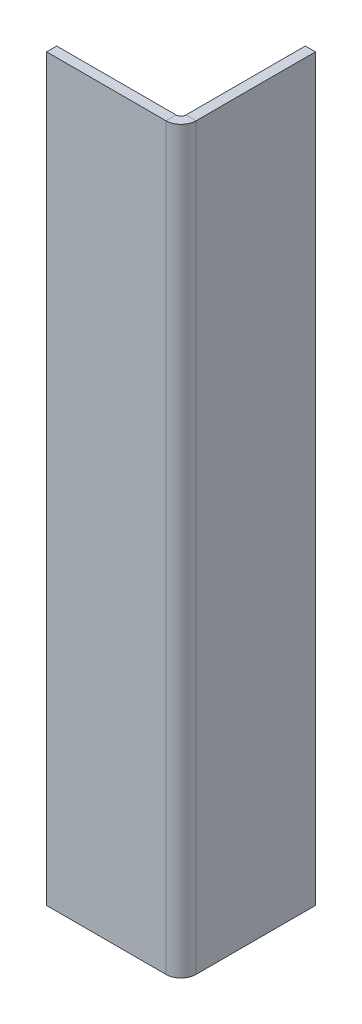
ISO-10303-21;
HEADER;
FILE_DESCRIPTION(('STEP AP214'),'2;1');
FILE_NAME('part.step','',(''),(''),'','','');
FILE_SCHEMA(('AUTOMOTIVE_DESIGN { 1 0 10303 214 1 1 1 1 }'));
ENDSEC;
DATA;
#1=APPLICATION_CONTEXT('core data for automotive mechanical design processes');
#2=APPLICATION_PROTOCOL_DEFINITION('international standard','automotive_design',2000,#1);
#3=PRODUCT_CONTEXT('',#1,'mechanical');
#4=PRODUCT('Part','Part','',(#3));
#5=PRODUCT_RELATED_PRODUCT_CATEGORY('part','',(#4));
#6=PRODUCT_DEFINITION_FORMATION('','',#4);
#7=PRODUCT_DEFINITION_CONTEXT('part definition',#1,'design');
#8=PRODUCT_DEFINITION('design','',#6,#7);
#9=PRODUCT_DEFINITION_SHAPE('','',#8);
#10=(LENGTH_UNIT() NAMED_UNIT(*) SI_UNIT(.MILLI.,.METRE.));
#11=(NAMED_UNIT(*) PLANE_ANGLE_UNIT() SI_UNIT($,.RADIAN.));
#12=(NAMED_UNIT(*) SI_UNIT($,.STERADIAN.) SOLID_ANGLE_UNIT());
#13=UNCERTAINTY_MEASURE_WITH_UNIT(LENGTH_MEASURE(1.E-05),#10,'distance_accuracy_value','');
#14=(GEOMETRIC_REPRESENTATION_CONTEXT(3) GLOBAL_UNCERTAINTY_ASSIGNED_CONTEXT((#13)) GLOBAL_UNIT_ASSIGNED_CONTEXT((#10,
#11,#12)) REPRESENTATION_CONTEXT('',''));
#15=CARTESIAN_POINT('',(0.,0.,0.));
#16=DIRECTION('',(0.,0.,1.));
#17=DIRECTION('',(1.,0.,0.));
#18=AXIS2_PLACEMENT_3D('',#15,#16,#17);
#19=CARTESIAN_POINT('',(-2.2366,110.,20.));
#20=DIRECTION('',(0.,1.,0.));
#21=DIRECTION('',(0.,0.,1.));
#22=AXIS2_PLACEMENT_3D('',#19,#20,#21);
#23=PLANE('',#22);
#24=DIRECTION('',(0.,0.,-1.));
#25=VECTOR('',#24,1.);
#26=CARTESIAN_POINT('',(-2.2366,110.,20.));
#27=LINE('',#26,#25);
#28=CARTESIAN_POINT('',(-2.2366,110.,20.));
#29=VERTEX_POINT('',#28);
#30=CARTESIAN_POINT('',(-2.2366,110.,18.5));
#31=VERTEX_POINT('',#30);
#32=EDGE_CURVE('E11',#29,#31,#27,.T.);
#33=ORIENTED_EDGE('',*,*,#32,.F.);
#34=CARTESIAN_POINT('',(-2.2366,110.,17.7634));
#35=DIRECTION('',(0.,1.,0.));
#36=DIRECTION('',(0.,0.,1.));
#37=AXIS2_PLACEMENT_3D('',#34,#35,#36);
#38=CIRCLE('',#37,2.2366);
#39=CARTESIAN_POINT('',(0.,110.,17.7634));
#40=VERTEX_POINT('',#39);
#41=EDGE_CURVE('E134',#40,#29,#38,.F.);
#42=ORIENTED_EDGE('',*,*,#41,.F.);
#43=DIRECTION('',(1.,0.,0.));
#44=VECTOR('',#43,1.);
#45=CARTESIAN_POINT('',(-1.5,110.,17.7634));
#46=LINE('',#45,#44);
#47=CARTESIAN_POINT('',(-1.5,110.,17.7634));
#48=VERTEX_POINT('',#47);
#49=EDGE_CURVE('E45',#48,#40,#46,.T.);
#50=ORIENTED_EDGE('',*,*,#49,.F.);
#51=CARTESIAN_POINT('',(-2.2366,110.,17.7634));
#52=DIRECTION('',(0.,1.,0.));
#53=DIRECTION('',(1.,0.,0.));
#54=AXIS2_PLACEMENT_3D('',#51,#52,#53);
#55=CIRCLE('',#54,0.7366);
#56=EDGE_CURVE('E127',#48,#31,#55,.F.);
#57=ORIENTED_EDGE('',*,*,#56,.T.);
#58=EDGE_LOOP('',(#33,#42,#50,#57));
#59=FACE_BOUND('',#58,.T.);
#60=ADVANCED_FACE('F37',(#59),#23,.T.);
#61=CARTESIAN_POINT('',(-1.5,110.,17.7634));
#62=DIRECTION('',(0.,1.,0.));
#63=DIRECTION('',(0.,0.,1.));
#64=AXIS2_PLACEMENT_3D('',#61,#62,#63);
#65=PLANE('',#64);
#66=DIRECTION('',(-1.,0.,0.));
#67=VECTOR('',#66,1.);
#68=CARTESIAN_POINT('',(0.,110.,20.));
#69=LINE('',#68,#67);
#70=CARTESIAN_POINT('',(-20.,110.,20.));
#71=VERTEX_POINT('',#70);
#72=EDGE_CURVE('E183',#29,#71,#69,.T.);
#73=ORIENTED_EDGE('',*,*,#72,.F.);
#74=ORIENTED_EDGE('',*,*,#32,.T.);
#75=DIRECTION('',(1.,0.,0.));
#76=VECTOR('',#75,1.);
#77=CARTESIAN_POINT('',(0.,110.,18.5));
#78=LINE('',#77,#76);
#79=CARTESIAN_POINT('',(-20.,110.,18.5));
#80=VERTEX_POINT('',#79);
#81=EDGE_CURVE('E93',#31,#80,#78,.F.);
#82=ORIENTED_EDGE('',*,*,#81,.T.);
#83=DIRECTION('',(0.,0.,-1.));
#84=VECTOR('',#83,1.);
#85=CARTESIAN_POINT('',(-20.,110.,20.));
#86=LINE('',#85,#84);
#87=EDGE_CURVE('E340',#71,#80,#86,.T.);
#88=ORIENTED_EDGE('',*,*,#87,.F.);
#89=EDGE_LOOP('',(#73,#74,#82,#88));
#90=FACE_BOUND('',#89,.T.);
#91=ADVANCED_FACE('F191',(#90),#65,.T.);
#92=CARTESIAN_POINT('',(0.,0.,17.7634));
#93=DIRECTION('',(0.,-1.,0.));
#94=DIRECTION('',(0.,0.,-1.));
#95=AXIS2_PLACEMENT_3D('',#92,#93,#94);
#96=PLANE('',#95);
#97=DIRECTION('',(-1.,0.,0.));
#98=VECTOR('',#97,1.);
#99=CARTESIAN_POINT('',(0.,0.,17.7634));
#100=LINE('',#99,#98);
#101=CARTESIAN_POINT('',(0.,0.,17.7634));
#102=VERTEX_POINT('',#101);
#103=CARTESIAN_POINT('',(-1.5,0.,17.7634));
#104=VERTEX_POINT('',#103);
#105=EDGE_CURVE('E80',#102,#104,#100,.T.);
#106=ORIENTED_EDGE('',*,*,#105,.F.);
#107=CARTESIAN_POINT('',(-2.2366,0.,17.7634));
#108=DIRECTION('',(0.,1.,0.));
#109=DIRECTION('',(0.,0.,1.));
#110=AXIS2_PLACEMENT_3D('',#107,#108,#109);
#111=CIRCLE('',#110,2.2366);
#112=CARTESIAN_POINT('',(-2.2366,0.,20.));
#113=VERTEX_POINT('',#112);
#114=EDGE_CURVE('E149',#102,#113,#111,.F.);
#115=ORIENTED_EDGE('',*,*,#114,.T.);
#116=DIRECTION('',(0.,0.,1.));
#117=VECTOR('',#116,1.);
#118=CARTESIAN_POINT('',(-2.2366,0.,18.5));
#119=LINE('',#118,#117);
#120=CARTESIAN_POINT('',(-2.2366,0.,18.5));
#121=VERTEX_POINT('',#120);
#122=EDGE_CURVE('E87',#121,#113,#119,.T.);
#123=ORIENTED_EDGE('',*,*,#122,.F.);
#124=CARTESIAN_POINT('',(-2.2366,0.,17.7634));
#125=DIRECTION('',(0.,1.,0.));
#126=DIRECTION('',(1.,0.,0.));
#127=AXIS2_PLACEMENT_3D('',#124,#125,#126);
#128=CIRCLE('',#127,0.7366);
#129=EDGE_CURVE('E156',#104,#121,#128,.F.);
#130=ORIENTED_EDGE('',*,*,#129,.F.);
#131=EDGE_LOOP('',(#106,#115,#123,#130));
#132=FACE_BOUND('',#131,.T.);
#133=ADVANCED_FACE('F189',(#132),#96,.T.);
#134=CARTESIAN_POINT('',(-2.2366,0.,18.5));
#135=DIRECTION('',(0.,-1.,0.));
#136=DIRECTION('',(0.,0.,-1.));
#137=AXIS2_PLACEMENT_3D('',#134,#135,#136);
#138=PLANE('',#137);
#139=DIRECTION('',(0.,0.,1.));
#140=VECTOR('',#139,1.);
#141=CARTESIAN_POINT('',(0.,0.,0.));
#142=LINE('',#141,#140);
#143=CARTESIAN_POINT('',(0.,0.,0.));
#144=VERTEX_POINT('',#143);
#145=EDGE_CURVE('E151',#144,#102,#142,.T.);
#146=ORIENTED_EDGE('',*,*,#145,.T.);
#147=ORIENTED_EDGE('',*,*,#105,.T.);
#148=DIRECTION('',(0.,0.,1.));
#149=VECTOR('',#148,1.);
#150=CARTESIAN_POINT('',(-1.5,0.,0.));
#151=LINE('',#150,#149);
#152=CARTESIAN_POINT('',(-1.5,0.,0.));
#153=VERTEX_POINT('',#152);
#154=EDGE_CURVE('E154',#153,#104,#151,.T.);
#155=ORIENTED_EDGE('',*,*,#154,.F.);
#156=DIRECTION('',(1.,0.,0.));
#157=VECTOR('',#156,1.);
#158=CARTESIAN_POINT('',(-1.5,0.,0.));
#159=LINE('',#158,#157);
#160=EDGE_CURVE('E115',#153,#144,#159,.T.);
#161=ORIENTED_EDGE('',*,*,#160,.T.);
#162=EDGE_LOOP('',(#146,#147,#155,#161));
#163=FACE_BOUND('',#162,.T.);
#164=ADVANCED_FACE('F185',(#163),#138,.T.);
#165=CARTESIAN_POINT('',(0.,110.,18.5));
#166=DIRECTION('',(0.,0.,1.));
#167=DIRECTION('',(1.,0.,0.));
#168=AXIS2_PLACEMENT_3D('',#165,#166,#167);
#169=PLANE('',#168);
#170=DIRECTION('',(1.,0.,0.));
#171=VECTOR('',#170,1.);
#172=CARTESIAN_POINT('',(0.,0.,18.5));
#173=LINE('',#172,#171);
#174=CARTESIAN_POINT('',(-20.,0.,18.5));
#175=VERTEX_POINT('',#174);
#176=EDGE_CURVE('E140',#121,#175,#173,.F.);
#177=ORIENTED_EDGE('',*,*,#176,.T.);
#178=DIRECTION('',(0.,-1.,0.));
#179=VECTOR('',#178,1.);
#180=CARTESIAN_POINT('',(-20.,110.,18.5));
#181=LINE('',#180,#179);
#182=EDGE_CURVE('E170',#80,#175,#181,.T.);
#183=ORIENTED_EDGE('',*,*,#182,.F.);
#184=ORIENTED_EDGE('',*,*,#81,.F.);
#185=DIRECTION('',(0.,-1.,0.));
#186=VECTOR('',#185,1.);
#187=CARTESIAN_POINT('',(-2.2366,110.,18.5));
#188=LINE('',#187,#186);
#189=EDGE_CURVE('E139',#31,#121,#188,.T.);
#190=ORIENTED_EDGE('',*,*,#189,.T.);
#191=EDGE_LOOP('',(#177,#183,#184,#190));
#192=FACE_BOUND('',#191,.T.);
#193=ADVANCED_FACE('F197',(#192),#169,.F.);
#194=CARTESIAN_POINT('',(-20.,110.,20.));
#195=DIRECTION('',(-1.,0.,0.));
#196=DIRECTION('',(0.,0.,1.));
#197=AXIS2_PLACEMENT_3D('',#194,#195,#196);
#198=PLANE('',#197);
#199=DIRECTION('',(0.,0.,-1.));
#200=VECTOR('',#199,1.);
#201=CARTESIAN_POINT('',(-20.,0.,20.));
#202=LINE('',#201,#200);
#203=CARTESIAN_POINT('',(-20.,0.,20.));
#204=VERTEX_POINT('',#203);
#205=EDGE_CURVE('E143',#204,#175,#202,.T.);
#206=ORIENTED_EDGE('',*,*,#205,.F.);
#207=DIRECTION('',(0.,-1.,0.));
#208=VECTOR('',#207,1.);
#209=CARTESIAN_POINT('',(-20.,110.,20.));
#210=LINE('',#209,#208);
#211=EDGE_CURVE('E168',#71,#204,#210,.T.);
#212=ORIENTED_EDGE('',*,*,#211,.F.);
#213=ORIENTED_EDGE('',*,*,#87,.T.);
#214=ORIENTED_EDGE('',*,*,#182,.T.);
#215=EDGE_LOOP('',(#206,#212,#213,#214));
#216=FACE_BOUND('',#215,.T.);
#217=ADVANCED_FACE('F228',(#216),#198,.T.);
#218=CARTESIAN_POINT('',(0.,110.,20.));
#219=DIRECTION('',(0.,0.,1.));
#220=DIRECTION('',(1.,0.,0.));
#221=AXIS2_PLACEMENT_3D('',#218,#219,#220);
#222=PLANE('',#221);
#223=DIRECTION('',(-1.,0.,0.));
#224=VECTOR('',#223,1.);
#225=CARTESIAN_POINT('',(0.,0.,20.));
#226=LINE('',#225,#224);
#227=EDGE_CURVE('E146',#113,#204,#226,.T.);
#228=ORIENTED_EDGE('',*,*,#227,.F.);
#229=DIRECTION('',(0.,-1.,0.));
#230=VECTOR('',#229,1.);
#231=CARTESIAN_POINT('',(-2.2366,110.,20.));
#232=LINE('',#231,#230);
#233=EDGE_CURVE('E165',#29,#113,#232,.T.);
#234=ORIENTED_EDGE('',*,*,#233,.F.);
#235=ORIENTED_EDGE('',*,*,#72,.T.);
#236=ORIENTED_EDGE('',*,*,#211,.T.);
#237=EDGE_LOOP('',(#228,#234,#235,#236));
#238=FACE_BOUND('',#237,.T.);
#239=ADVANCED_FACE('F239',(#238),#222,.T.);
#240=CARTESIAN_POINT('',(-2.2366,110.,17.7634));
#241=DIRECTION('',(0.,-1.,0.));
#242=DIRECTION('',(0.,0.,-1.));
#243=AXIS2_PLACEMENT_3D('',#240,#241,#242);
#244=CYLINDRICAL_SURFACE('',#243,2.2366);
#245=ORIENTED_EDGE('',*,*,#114,.F.);
#246=DIRECTION('',(0.,-1.,0.));
#247=VECTOR('',#246,1.);
#248=CARTESIAN_POINT('',(0.,110.,17.7634));
#249=LINE('',#248,#247);
#250=EDGE_CURVE('E162',#40,#102,#249,.T.);
#251=ORIENTED_EDGE('',*,*,#250,.F.);
#252=ORIENTED_EDGE('',*,*,#41,.T.);
#253=ORIENTED_EDGE('',*,*,#233,.T.);
#254=EDGE_LOOP('',(#245,#251,#252,#253));
#255=FACE_BOUND('',#254,.T.);
#256=ADVANCED_FACE('F179',(#255),#244,.T.);
#257=CARTESIAN_POINT('',(0.,110.,0.));
#258=DIRECTION('',(1.,0.,0.));
#259=DIRECTION('',(0.,0.,-1.));
#260=AXIS2_PLACEMENT_3D('',#257,#258,#259);
#261=PLANE('',#260);
#262=ORIENTED_EDGE('',*,*,#145,.F.);
#263=DIRECTION('',(0.,-1.,0.));
#264=VECTOR('',#263,1.);
#265=CARTESIAN_POINT('',(0.,110.,0.));
#266=LINE('',#265,#264);
#267=CARTESIAN_POINT('',(0.,110.,0.));
#268=VERTEX_POINT('',#267);
#269=EDGE_CURVE('E117',#268,#144,#266,.T.);
#270=ORIENTED_EDGE('',*,*,#269,.F.);
#271=DIRECTION('',(0.,0.,1.));
#272=VECTOR('',#271,1.);
#273=CARTESIAN_POINT('',(0.,110.,0.));
#274=LINE('',#273,#272);
#275=EDGE_CURVE('E132',#268,#40,#274,.T.);
#276=ORIENTED_EDGE('',*,*,#275,.T.);
#277=ORIENTED_EDGE('',*,*,#250,.T.);
#278=EDGE_LOOP('',(#262,#270,#276,#277));
#279=FACE_BOUND('',#278,.T.);
#280=ADVANCED_FACE('F184',(#279),#261,.T.);
#281=CARTESIAN_POINT('',(-1.5,110.,0.));
#282=DIRECTION('',(0.,0.,-1.));
#283=DIRECTION('',(-1.,0.,0.));
#284=AXIS2_PLACEMENT_3D('',#281,#282,#283);
#285=PLANE('',#284);
#286=ORIENTED_EDGE('',*,*,#160,.F.);
#287=DIRECTION('',(0.,-1.,0.));
#288=VECTOR('',#287,1.);
#289=CARTESIAN_POINT('',(-1.5,110.,0.));
#290=LINE('',#289,#288);
#291=CARTESIAN_POINT('',(-1.5,110.,0.));
#292=VERTEX_POINT('',#291);
#293=EDGE_CURVE('E109',#292,#153,#290,.T.);
#294=ORIENTED_EDGE('',*,*,#293,.F.);
#295=DIRECTION('',(1.,0.,0.));
#296=VECTOR('',#295,1.);
#297=CARTESIAN_POINT('',(-1.5,110.,0.));
#298=LINE('',#297,#296);
#299=EDGE_CURVE('E113',#292,#268,#298,.T.);
#300=ORIENTED_EDGE('',*,*,#299,.T.);
#301=ORIENTED_EDGE('',*,*,#269,.T.);
#302=EDGE_LOOP('',(#286,#294,#300,#301));
#303=FACE_BOUND('',#302,.T.);
#304=ADVANCED_FACE('F111',(#303),#285,.T.);
#305=CARTESIAN_POINT('',(-1.5,110.,0.));
#306=DIRECTION('',(1.,0.,0.));
#307=DIRECTION('',(0.,0.,-1.));
#308=AXIS2_PLACEMENT_3D('',#305,#306,#307);
#309=PLANE('',#308);
#310=ORIENTED_EDGE('',*,*,#154,.T.);
#311=DIRECTION('',(0.,-1.,0.));
#312=VECTOR('',#311,1.);
#313=CARTESIAN_POINT('',(-1.5,110.,17.7634));
#314=LINE('',#313,#312);
#315=EDGE_CURVE('E118',#48,#104,#314,.T.);
#316=ORIENTED_EDGE('',*,*,#315,.F.);
#317=DIRECTION('',(0.,0.,1.));
#318=VECTOR('',#317,1.);
#319=CARTESIAN_POINT('',(-1.5,110.,0.));
#320=LINE('',#319,#318);
#321=EDGE_CURVE('E122',#292,#48,#320,.T.);
#322=ORIENTED_EDGE('',*,*,#321,.F.);
#323=ORIENTED_EDGE('',*,*,#293,.T.);
#324=EDGE_LOOP('',(#310,#316,#322,#323));
#325=FACE_BOUND('',#324,.T.);
#326=ADVANCED_FACE('F123',(#325),#309,.F.);
#327=CARTESIAN_POINT('',(-2.2366,110.,17.7634));
#328=DIRECTION('',(0.,-1.,0.));
#329=DIRECTION('',(0.,0.,-1.));
#330=AXIS2_PLACEMENT_3D('',#327,#328,#329);
#331=CYLINDRICAL_SURFACE('',#330,0.7366);
#332=ORIENTED_EDGE('',*,*,#129,.T.);
#333=ORIENTED_EDGE('',*,*,#189,.F.);
#334=ORIENTED_EDGE('',*,*,#56,.F.);
#335=ORIENTED_EDGE('',*,*,#315,.T.);
#336=EDGE_LOOP('',(#332,#333,#334,#335));
#337=FACE_BOUND('',#336,.T.);
#338=ADVANCED_FACE('F187',(#337),#331,.F.);
#339=CARTESIAN_POINT('',(-2.2366,110.,17.7634));
#340=DIRECTION('',(0.,1.,0.));
#341=DIRECTION('',(1.,0.,0.));
#342=AXIS2_PLACEMENT_3D('',#339,#340,#341);
#343=PLANE('',#342);
#344=ORIENTED_EDGE('',*,*,#321,.T.);
#345=ORIENTED_EDGE('',*,*,#49,.T.);
#346=ORIENTED_EDGE('',*,*,#275,.F.);
#347=ORIENTED_EDGE('',*,*,#299,.F.);
#348=EDGE_LOOP('',(#344,#345,#346,#347));
#349=FACE_BOUND('',#348,.T.);
#350=ADVANCED_FACE('F130',(#349),#343,.T.);
#351=CARTESIAN_POINT('',(-2.2366,0.,17.7634));
#352=DIRECTION('',(0.,1.,0.));
#353=DIRECTION('',(1.,0.,0.));
#354=AXIS2_PLACEMENT_3D('',#351,#352,#353);
#355=PLANE('',#354);
#356=ORIENTED_EDGE('',*,*,#176,.F.);
#357=ORIENTED_EDGE('',*,*,#122,.T.);
#358=ORIENTED_EDGE('',*,*,#227,.T.);
#359=ORIENTED_EDGE('',*,*,#205,.T.);
#360=EDGE_LOOP('',(#356,#357,#358,#359));
#361=FACE_BOUND('',#360,.T.);
#362=ADVANCED_FACE('F305',(#361),#355,.F.);
#363=CLOSED_SHELL('',(#60,#91,#133,#164,#193,#217,#239,#256,#280,#304,#326,#338,#350,#362));
#364=MANIFOLD_SOLID_BREP('B2',#363);
#365=ADVANCED_BREP_SHAPE_REPRESENTATION('',(#18,#364),#14);
#366=SHAPE_DEFINITION_REPRESENTATION(#9,#365);
ENDSEC;
END-ISO-10303-21;
